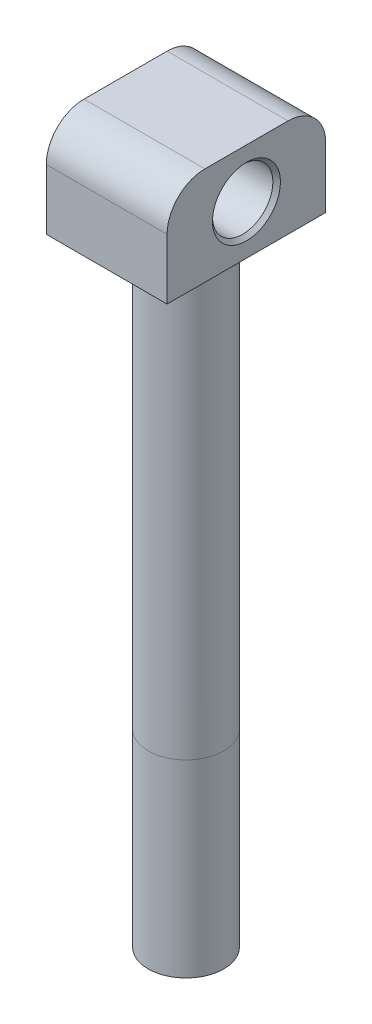
ISO-10303-21;
HEADER;
FILE_DESCRIPTION(('STEP AP214'),'2;1');
FILE_NAME('part.step','',(''),(''),'','','');
FILE_SCHEMA(('AUTOMOTIVE_DESIGN { 1 0 10303 214 1 1 1 1 }'));
ENDSEC;
DATA;
#1=APPLICATION_CONTEXT('core data for automotive mechanical design processes');
#2=APPLICATION_PROTOCOL_DEFINITION('international standard','automotive_design',2000,#1);
#3=PRODUCT_CONTEXT('',#1,'mechanical');
#4=PRODUCT('Part','Part','',(#3));
#5=PRODUCT_RELATED_PRODUCT_CATEGORY('part','',(#4));
#6=PRODUCT_DEFINITION_FORMATION('','',#4);
#7=PRODUCT_DEFINITION_CONTEXT('part definition',#1,'design');
#8=PRODUCT_DEFINITION('design','',#6,#7);
#9=PRODUCT_DEFINITION_SHAPE('','',#8);
#10=(LENGTH_UNIT() NAMED_UNIT(*) SI_UNIT(.MILLI.,.METRE.));
#11=(NAMED_UNIT(*) PLANE_ANGLE_UNIT() SI_UNIT($,.RADIAN.));
#12=(NAMED_UNIT(*) SI_UNIT($,.STERADIAN.) SOLID_ANGLE_UNIT());
#13=UNCERTAINTY_MEASURE_WITH_UNIT(LENGTH_MEASURE(1.E-05),#10,'distance_accuracy_value','');
#14=(GEOMETRIC_REPRESENTATION_CONTEXT(3) GLOBAL_UNCERTAINTY_ASSIGNED_CONTEXT((#13)) GLOBAL_UNIT_ASSIGNED_CONTEXT((#10,
#11,#12)) REPRESENTATION_CONTEXT('',''));
#15=CARTESIAN_POINT('',(0.,0.,0.));
#16=DIRECTION('',(0.,0.,1.));
#17=DIRECTION('',(1.,0.,0.));
#18=AXIS2_PLACEMENT_3D('',#15,#16,#17);
#19=CARTESIAN_POINT('',(0.,-50.,0.));
#20=DIRECTION('',(0.,1.,0.));
#21=DIRECTION('',(0.,0.,1.));
#22=AXIS2_PLACEMENT_3D('',#19,#20,#21);
#23=CYLINDRICAL_SURFACE('',#22,5.);
#24=CARTESIAN_POINT('',(0.,-82.9845859597524,0.));
#25=DIRECTION('',(0.,1.,0.));
#26=DIRECTION('',(0.,0.,1.));
#27=AXIS2_PLACEMENT_3D('',#24,#25,#26);
#28=CIRCLE('',#27,5.);
#29=CARTESIAN_POINT('',(0.,-82.9845859597524,5.));
#30=VERTEX_POINT('',#29);
#31=EDGE_CURVE('E105',#30,#30,#28,.F.);
#32=ORIENTED_EDGE('',*,*,#31,.F.);
#33=EDGE_LOOP('',(#32));
#34=FACE_BOUND('',#33,.T.);
#35=CARTESIAN_POINT('',(0.,-57.9845859597524,0.));
#36=DIRECTION('',(0.,-1.,0.));
#37=DIRECTION('',(0.,0.,1.));
#38=AXIS2_PLACEMENT_3D('',#35,#36,#37);
#39=CIRCLE('',#38,5.);
#40=CARTESIAN_POINT('',(0.,-57.9845859597524,5.));
#41=VERTEX_POINT('',#40);
#42=EDGE_CURVE('E12',#41,#41,#39,.T.);
#43=ORIENTED_EDGE('',*,*,#42,.T.);
#44=EDGE_LOOP('',(#43));
#45=FACE_BOUND('',#44,.T.);
#46=ADVANCED_FACE('F19',(#34,#45),#23,.T.);
#47=ORIENTED_EDGE('',*,*,#42,.F.);
#48=EDGE_LOOP('',(#47));
#49=FACE_BOUND('',#48,.T.);
#50=CARTESIAN_POINT('',(0.,0.,0.));
#51=DIRECTION('',(0.,-1.,0.));
#52=DIRECTION('',(0.,0.,-1.));
#53=AXIS2_PLACEMENT_3D('',#50,#51,#52);
#54=CIRCLE('',#53,5.);
#55=CARTESIAN_POINT('',(0.,0.,-5.));
#56=VERTEX_POINT('',#55);
#57=EDGE_CURVE('E131',#56,#56,#54,.F.);
#58=ORIENTED_EDGE('',*,*,#57,.F.);
#59=EDGE_LOOP('',(#58));
#60=FACE_BOUND('',#59,.T.);
#61=ADVANCED_FACE('F123',(#49,#60),#23,.T.);
#62=CARTESIAN_POINT('',(-5.,8.,-10.5));
#63=DIRECTION('',(0.,0.,-1.));
#64=DIRECTION('',(-1.,0.,0.));
#65=AXIS2_PLACEMENT_3D('',#62,#63,#64);
#66=PLANE('',#65);
#67=DIRECTION('',(0.,-1.,0.));
#68=VECTOR('',#67,1.);
#69=CARTESIAN_POINT('',(-8.,8.,-10.5));
#70=LINE('',#69,#68);
#71=CARTESIAN_POINT('',(-8.,8.,-10.5));
#72=VERTEX_POINT('',#71);
#73=CARTESIAN_POINT('',(-8.,0.,-10.5));
#74=VERTEX_POINT('',#73);
#75=EDGE_CURVE('E68',#72,#74,#70,.T.);
#76=ORIENTED_EDGE('',*,*,#75,.F.);
#77=DIRECTION('',(1.,0.,0.));
#78=VECTOR('',#77,1.);
#79=CARTESIAN_POINT('',(5.,8.,-10.5));
#80=LINE('',#79,#78);
#81=CARTESIAN_POINT('',(8.,8.,-10.5));
#82=VERTEX_POINT('',#81);
#83=EDGE_CURVE('E54',#72,#82,#80,.T.);
#84=ORIENTED_EDGE('',*,*,#83,.T.);
#85=DIRECTION('',(0.,-1.,0.));
#86=VECTOR('',#85,1.);
#87=CARTESIAN_POINT('',(8.,8.,-10.5));
#88=LINE('',#87,#86);
#89=CARTESIAN_POINT('',(8.,0.,-10.5));
#90=VERTEX_POINT('',#89);
#91=EDGE_CURVE('E65',#82,#90,#88,.T.);
#92=ORIENTED_EDGE('',*,*,#91,.T.);
#93=DIRECTION('',(1.,0.,0.));
#94=VECTOR('',#93,1.);
#95=CARTESIAN_POINT('',(-5.,0.,-10.5));
#96=LINE('',#95,#94);
#97=EDGE_CURVE('E89',#74,#90,#96,.T.);
#98=ORIENTED_EDGE('',*,*,#97,.F.);
#99=EDGE_LOOP('',(#76,#84,#92,#98));
#100=FACE_BOUND('',#99,.T.);
#101=ADVANCED_FACE('F62',(#100),#66,.T.);
#102=CARTESIAN_POINT('',(8.,8.,-7.5));
#103=DIRECTION('',(1.,0.,0.));
#104=DIRECTION('',(0.,0.,-1.));
#105=AXIS2_PLACEMENT_3D('',#102,#103,#104);
#106=PLANE('',#105);
#107=CARTESIAN_POINT('',(8.,6.49917288822526,0.));
#108=DIRECTION('',(1.,0.,0.));
#109=DIRECTION('',(0.,0.,-1.));
#110=AXIS2_PLACEMENT_3D('',#107,#108,#109);
#111=CIRCLE('',#110,4.5);
#112=CARTESIAN_POINT('',(8.,6.49917288822526,-4.5));
#113=VERTEX_POINT('',#112);
#114=EDGE_CURVE('E113',#113,#113,#111,.F.);
#115=ORIENTED_EDGE('',*,*,#114,.T.);
#116=EDGE_LOOP('',(#115));
#117=FACE_BOUND('',#116,.T.);
#118=ORIENTED_EDGE('',*,*,#91,.F.);
#119=CARTESIAN_POINT('',(8.,8.,-5.5));
#120=DIRECTION('',(1.,0.,0.));
#121=DIRECTION('',(0.,0.,-1.));
#122=AXIS2_PLACEMENT_3D('',#119,#120,#121);
#123=CIRCLE('',#122,5.);
#124=CARTESIAN_POINT('',(8.,13.,-5.5));
#125=VERTEX_POINT('',#124);
#126=EDGE_CURVE('E50',#82,#125,#123,.T.);
#127=ORIENTED_EDGE('',*,*,#126,.T.);
#128=DIRECTION('',(0.,0.,1.));
#129=VECTOR('',#128,1.);
#130=CARTESIAN_POINT('',(8.,13.,-7.5));
#131=LINE('',#130,#129);
#132=CARTESIAN_POINT('',(8.,13.,5.5));
#133=VERTEX_POINT('',#132);
#134=EDGE_CURVE('E96',#125,#133,#131,.T.);
#135=ORIENTED_EDGE('',*,*,#134,.T.);
#136=CARTESIAN_POINT('',(8.,8.,5.5));
#137=DIRECTION('',(1.,0.,0.));
#138=DIRECTION('',(0.,0.,-1.));
#139=AXIS2_PLACEMENT_3D('',#136,#137,#138);
#140=CIRCLE('',#139,5.);
#141=CARTESIAN_POINT('',(8.,8.,10.5));
#142=VERTEX_POINT('',#141);
#143=EDGE_CURVE('E69',#133,#142,#140,.T.);
#144=ORIENTED_EDGE('',*,*,#143,.T.);
#145=DIRECTION('',(0.,-1.,0.));
#146=VECTOR('',#145,1.);
#147=CARTESIAN_POINT('',(8.,8.,10.5));
#148=LINE('',#147,#146);
#149=CARTESIAN_POINT('',(8.,0.,10.5));
#150=VERTEX_POINT('',#149);
#151=EDGE_CURVE('E77',#142,#150,#148,.T.);
#152=ORIENTED_EDGE('',*,*,#151,.T.);
#153=DIRECTION('',(0.,0.,1.));
#154=VECTOR('',#153,1.);
#155=CARTESIAN_POINT('',(8.,0.,-7.5));
#156=LINE('',#155,#154);
#157=EDGE_CURVE('E74',#90,#150,#156,.T.);
#158=ORIENTED_EDGE('',*,*,#157,.F.);
#159=EDGE_LOOP('',(#118,#127,#135,#144,#152,#158));
#160=FACE_BOUND('',#159,.T.);
#161=ADVANCED_FACE('F71',(#117,#160),#106,.T.);
#162=CARTESIAN_POINT('',(5.,8.,10.5));
#163=DIRECTION('',(0.,0.,1.));
#164=DIRECTION('',(1.,0.,0.));
#165=AXIS2_PLACEMENT_3D('',#162,#163,#164);
#166=PLANE('',#165);
#167=ORIENTED_EDGE('',*,*,#151,.F.);
#168=DIRECTION('',(-1.,0.,0.));
#169=VECTOR('',#168,1.);
#170=CARTESIAN_POINT('',(-5.,8.,10.5));
#171=LINE('',#170,#169);
#172=CARTESIAN_POINT('',(-8.,8.,10.5));
#173=VERTEX_POINT('',#172);
#174=EDGE_CURVE('E76',#142,#173,#171,.T.);
#175=ORIENTED_EDGE('',*,*,#174,.T.);
#176=DIRECTION('',(0.,-1.,0.));
#177=VECTOR('',#176,1.);
#178=CARTESIAN_POINT('',(-8.,8.,10.5));
#179=LINE('',#178,#177);
#180=CARTESIAN_POINT('',(-8.,0.,10.5));
#181=VERTEX_POINT('',#180);
#182=EDGE_CURVE('E82',#173,#181,#179,.T.);
#183=ORIENTED_EDGE('',*,*,#182,.T.);
#184=DIRECTION('',(-1.,0.,0.));
#185=VECTOR('',#184,1.);
#186=CARTESIAN_POINT('',(5.,0.,10.5));
#187=LINE('',#186,#185);
#188=EDGE_CURVE('E88',#150,#181,#187,.T.);
#189=ORIENTED_EDGE('',*,*,#188,.F.);
#190=EDGE_LOOP('',(#167,#175,#183,#189));
#191=FACE_BOUND('',#190,.T.);
#192=ADVANCED_FACE('F172',(#191),#166,.T.);
#193=CARTESIAN_POINT('',(-8.,8.,7.5));
#194=DIRECTION('',(-1.,0.,0.));
#195=DIRECTION('',(0.,0.,1.));
#196=AXIS2_PLACEMENT_3D('',#193,#194,#195);
#197=PLANE('',#196);
#198=CARTESIAN_POINT('',(-8.,6.49917288822526,0.));
#199=DIRECTION('',(-1.,0.,0.));
#200=DIRECTION('',(0.,0.,1.));
#201=AXIS2_PLACEMENT_3D('',#198,#199,#200);
#202=CIRCLE('',#201,4.5);
#203=CARTESIAN_POINT('',(-8.,6.49917288822526,4.5));
#204=VERTEX_POINT('',#203);
#205=EDGE_CURVE('E107',#204,#204,#202,.F.);
#206=ORIENTED_EDGE('',*,*,#205,.T.);
#207=EDGE_LOOP('',(#206));
#208=FACE_BOUND('',#207,.T.);
#209=DIRECTION('',(0.,0.,-1.));
#210=VECTOR('',#209,1.);
#211=CARTESIAN_POINT('',(-8.,13.,7.5));
#212=LINE('',#211,#210);
#213=CARTESIAN_POINT('',(-8.,13.,5.5));
#214=VERTEX_POINT('',#213);
#215=CARTESIAN_POINT('',(-8.,13.,-5.5));
#216=VERTEX_POINT('',#215);
#217=EDGE_CURVE('E98',#214,#216,#212,.T.);
#218=ORIENTED_EDGE('',*,*,#217,.T.);
#219=CARTESIAN_POINT('',(-8.,8.,-5.5));
#220=DIRECTION('',(-1.,0.,0.));
#221=DIRECTION('',(0.,0.,1.));
#222=AXIS2_PLACEMENT_3D('',#219,#220,#221);
#223=CIRCLE('',#222,5.);
#224=EDGE_CURVE('E92',#216,#72,#223,.T.);
#225=ORIENTED_EDGE('',*,*,#224,.T.);
#226=ORIENTED_EDGE('',*,*,#75,.T.);
#227=DIRECTION('',(0.,0.,-1.));
#228=VECTOR('',#227,1.);
#229=CARTESIAN_POINT('',(-8.,0.,7.5));
#230=LINE('',#229,#228);
#231=EDGE_CURVE('E99',#181,#74,#230,.T.);
#232=ORIENTED_EDGE('',*,*,#231,.F.);
#233=ORIENTED_EDGE('',*,*,#182,.F.);
#234=CARTESIAN_POINT('',(-8.,8.,5.5));
#235=DIRECTION('',(-1.,0.,0.));
#236=DIRECTION('',(0.,0.,1.));
#237=AXIS2_PLACEMENT_3D('',#234,#235,#236);
#238=CIRCLE('',#237,5.);
#239=EDGE_CURVE('E80',#173,#214,#238,.T.);
#240=ORIENTED_EDGE('',*,*,#239,.T.);
#241=EDGE_LOOP('',(#218,#225,#226,#232,#233,#240));
#242=FACE_BOUND('',#241,.T.);
#243=ADVANCED_FACE('F158',(#208,#242),#197,.T.);
#244=CARTESIAN_POINT('',(0.,13.,0.));
#245=DIRECTION('',(0.,-1.,0.));
#246=DIRECTION('',(0.,0.,-1.));
#247=AXIS2_PLACEMENT_3D('',#244,#245,#246);
#248=PLANE('',#247);
#249=ORIENTED_EDGE('',*,*,#134,.F.);
#250=DIRECTION('',(1.,0.,0.));
#251=VECTOR('',#250,1.);
#252=CARTESIAN_POINT('',(-5.,13.,-5.5));
#253=LINE('',#252,#251);
#254=EDGE_CURVE('E36',#125,#216,#253,.F.);
#255=ORIENTED_EDGE('',*,*,#254,.T.);
#256=ORIENTED_EDGE('',*,*,#217,.F.);
#257=DIRECTION('',(-1.,0.,0.));
#258=VECTOR('',#257,1.);
#259=CARTESIAN_POINT('',(5.,13.,5.5));
#260=LINE('',#259,#258);
#261=EDGE_CURVE('E93',#214,#133,#260,.F.);
#262=ORIENTED_EDGE('',*,*,#261,.T.);
#263=EDGE_LOOP('',(#249,#255,#256,#262));
#264=FACE_BOUND('',#263,.T.);
#265=ADVANCED_FACE('F161',(#264),#248,.F.);
#266=CARTESIAN_POINT('',(0.,0.,0.));
#267=DIRECTION('',(0.,-1.,0.));
#268=DIRECTION('',(0.,0.,-1.));
#269=AXIS2_PLACEMENT_3D('',#266,#267,#268);
#270=PLANE('',#269);
#271=ORIENTED_EDGE('',*,*,#231,.T.);
#272=ORIENTED_EDGE('',*,*,#97,.T.);
#273=ORIENTED_EDGE('',*,*,#157,.T.);
#274=ORIENTED_EDGE('',*,*,#188,.T.);
#275=EDGE_LOOP('',(#271,#272,#273,#274));
#276=FACE_BOUND('',#275,.T.);
#277=ORIENTED_EDGE('',*,*,#57,.T.);
#278=EDGE_LOOP('',(#277));
#279=FACE_BOUND('',#278,.T.);
#280=ADVANCED_FACE('F151',(#276,#279),#270,.T.);
#281=CARTESIAN_POINT('',(5.,8.,5.5));
#282=DIRECTION('',(1.,0.,0.));
#283=DIRECTION('',(0.,0.,-1.));
#284=AXIS2_PLACEMENT_3D('',#281,#282,#283);
#285=CYLINDRICAL_SURFACE('',#284,5.);
#286=ORIENTED_EDGE('',*,*,#143,.F.);
#287=ORIENTED_EDGE('',*,*,#261,.F.);
#288=ORIENTED_EDGE('',*,*,#239,.F.);
#289=ORIENTED_EDGE('',*,*,#174,.F.);
#290=EDGE_LOOP('',(#286,#287,#288,#289));
#291=FACE_BOUND('',#290,.T.);
#292=ADVANCED_FACE('F165',(#291),#285,.T.);
#293=CARTESIAN_POINT('',(-5.,8.,-5.5));
#294=DIRECTION('',(-1.,0.,0.));
#295=DIRECTION('',(0.,0.,1.));
#296=AXIS2_PLACEMENT_3D('',#293,#294,#295);
#297=CYLINDRICAL_SURFACE('',#296,5.);
#298=ORIENTED_EDGE('',*,*,#224,.F.);
#299=ORIENTED_EDGE('',*,*,#254,.F.);
#300=ORIENTED_EDGE('',*,*,#126,.F.);
#301=ORIENTED_EDGE('',*,*,#83,.F.);
#302=EDGE_LOOP('',(#298,#299,#300,#301));
#303=FACE_BOUND('',#302,.T.);
#304=ADVANCED_FACE('F53',(#303),#297,.T.);
#305=CARTESIAN_POINT('',(-5.8876187570005,6.49917288822526,0.));
#306=DIRECTION('',(1.,0.,0.));
#307=DIRECTION('',(0.,0.,-1.));
#308=AXIS2_PLACEMENT_3D('',#305,#306,#307);
#309=CYLINDRICAL_SURFACE('',#308,4.);
#310=CARTESIAN_POINT('',(7.5,6.49917288822526,0.));
#311=DIRECTION('',(1.,0.,0.));
#312=DIRECTION('',(0.,0.,-1.));
#313=AXIS2_PLACEMENT_3D('',#310,#311,#312);
#314=CIRCLE('',#313,4.);
#315=CARTESIAN_POINT('',(7.5,6.49917288822526,-4.));
#316=VERTEX_POINT('',#315);
#317=EDGE_CURVE('E29',#316,#316,#314,.T.);
#318=ORIENTED_EDGE('',*,*,#317,.T.);
#319=EDGE_LOOP('',(#318));
#320=FACE_BOUND('',#319,.T.);
#321=CARTESIAN_POINT('',(-7.5,6.49917288822526,0.));
#322=DIRECTION('',(-1.,0.,0.));
#323=DIRECTION('',(0.,0.,1.));
#324=AXIS2_PLACEMENT_3D('',#321,#322,#323);
#325=CIRCLE('',#324,4.);
#326=CARTESIAN_POINT('',(-7.5,6.49917288822526,4.));
#327=VERTEX_POINT('',#326);
#328=EDGE_CURVE('E110',#327,#327,#325,.T.);
#329=ORIENTED_EDGE('',*,*,#328,.T.);
#330=EDGE_LOOP('',(#329));
#331=FACE_BOUND('',#330,.T.);
#332=ADVANCED_FACE('F195',(#320,#331),#309,.F.);
#333=CARTESIAN_POINT('',(0.,-82.9845859597524,0.));
#334=DIRECTION('',(0.,1.,0.));
#335=DIRECTION('',(0.,0.,1.));
#336=AXIS2_PLACEMENT_3D('',#333,#334,#335);
#337=PLANE('',#336);
#338=ORIENTED_EDGE('',*,*,#31,.T.);
#339=EDGE_LOOP('',(#338));
#340=FACE_BOUND('',#339,.T.);
#341=ADVANCED_FACE('F21',(#340),#337,.F.);
#342=CARTESIAN_POINT('',(-8.,6.49917288822526,0.));
#343=DIRECTION('',(-1.,0.,0.));
#344=DIRECTION('',(0.,0.,1.));
#345=AXIS2_PLACEMENT_3D('',#342,#343,#344);
#346=CONICAL_SURFACE('',#345,4.5,0.785398163397448);
#347=ORIENTED_EDGE('',*,*,#328,.F.);
#348=EDGE_LOOP('',(#347));
#349=FACE_BOUND('',#348,.T.);
#350=ORIENTED_EDGE('',*,*,#205,.F.);
#351=EDGE_LOOP('',(#350));
#352=FACE_BOUND('',#351,.T.);
#353=ADVANCED_FACE('F201',(#349,#352),#346,.F.);
#354=CARTESIAN_POINT('',(8.,6.49917288822526,0.));
#355=DIRECTION('',(1.,0.,0.));
#356=DIRECTION('',(0.,0.,-1.));
#357=AXIS2_PLACEMENT_3D('',#354,#355,#356);
#358=CONICAL_SURFACE('',#357,4.5,0.785398163397449);
#359=ORIENTED_EDGE('',*,*,#317,.F.);
#360=EDGE_LOOP('',(#359));
#361=FACE_BOUND('',#360,.T.);
#362=ORIENTED_EDGE('',*,*,#114,.F.);
#363=EDGE_LOOP('',(#362));
#364=FACE_BOUND('',#363,.T.);
#365=ADVANCED_FACE('F208',(#361,#364),#358,.F.);
#366=CLOSED_SHELL('',(#46,#61,#101,#161,#192,#243,#265,#280,#292,#304,#332,#341,#353,#365));
#367=MANIFOLD_SOLID_BREP('B1',#366);
#368=ADVANCED_BREP_SHAPE_REPRESENTATION('',(#18,#367),#14);
#369=SHAPE_DEFINITION_REPRESENTATION(#9,#368);
ENDSEC;
END-ISO-10303-21;
